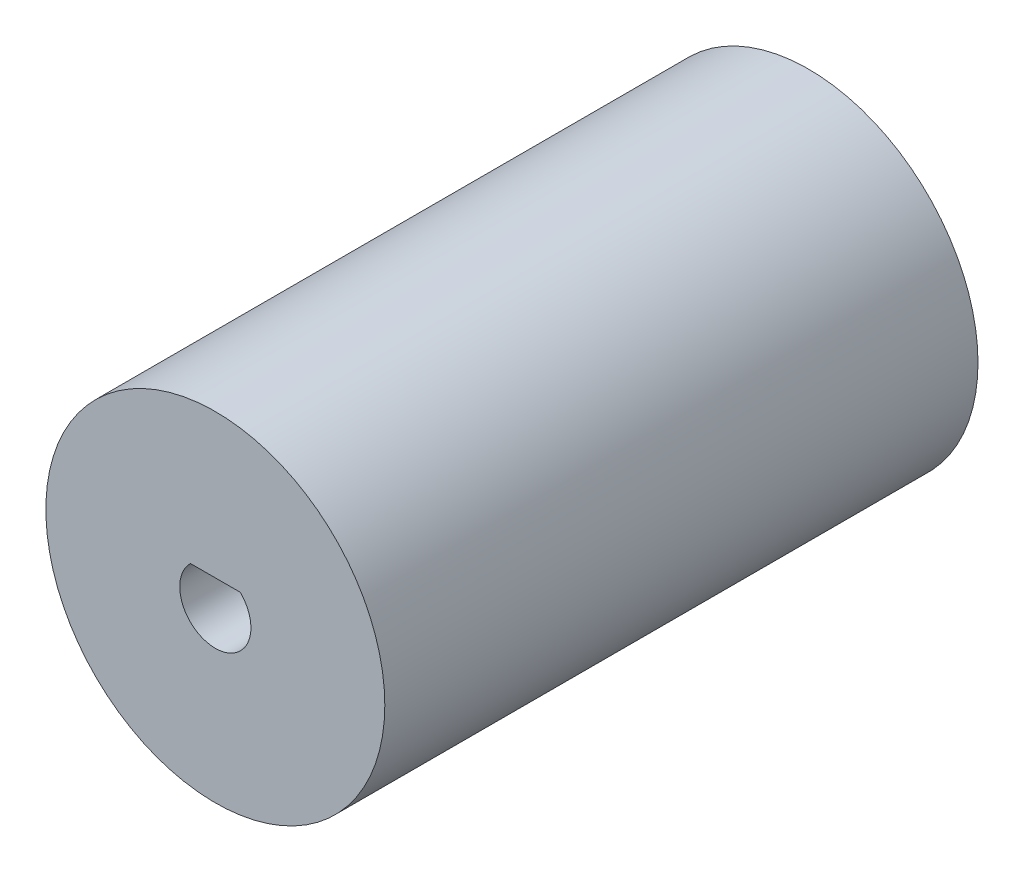
ISO-10303-21;
HEADER;
FILE_DESCRIPTION(('STEP AP214'),'2;1');
FILE_NAME('part.step','',(''),(''),'','','');
FILE_SCHEMA(('AUTOMOTIVE_DESIGN { 1 0 10303 214 1 1 1 1 }'));
ENDSEC;
DATA;
#1=APPLICATION_CONTEXT('core data for automotive mechanical design processes');
#2=APPLICATION_PROTOCOL_DEFINITION('international standard','automotive_design',2000,#1);
#3=PRODUCT_CONTEXT('',#1,'mechanical');
#4=PRODUCT('Part','Part','',(#3));
#5=PRODUCT_RELATED_PRODUCT_CATEGORY('part','',(#4));
#6=PRODUCT_DEFINITION_FORMATION('','',#4);
#7=PRODUCT_DEFINITION_CONTEXT('part definition',#1,'design');
#8=PRODUCT_DEFINITION('design','',#6,#7);
#9=PRODUCT_DEFINITION_SHAPE('','',#8);
#10=(LENGTH_UNIT() NAMED_UNIT(*) SI_UNIT(.MILLI.,.METRE.));
#11=(NAMED_UNIT(*) PLANE_ANGLE_UNIT() SI_UNIT($,.RADIAN.));
#12=(NAMED_UNIT(*) SI_UNIT($,.STERADIAN.) SOLID_ANGLE_UNIT());
#13=UNCERTAINTY_MEASURE_WITH_UNIT(LENGTH_MEASURE(1.E-05),#10,'distance_accuracy_value','');
#14=(GEOMETRIC_REPRESENTATION_CONTEXT(3) GLOBAL_UNCERTAINTY_ASSIGNED_CONTEXT((#13)) GLOBAL_UNIT_ASSIGNED_CONTEXT((#10,
#11,#12)) REPRESENTATION_CONTEXT('',''));
#15=CARTESIAN_POINT('',(0.,0.,0.));
#16=DIRECTION('',(0.,0.,1.));
#17=DIRECTION('',(1.,0.,0.));
#18=AXIS2_PLACEMENT_3D('',#15,#16,#17);
#19=CARTESIAN_POINT('',(0.,0.,35.));
#20=DIRECTION('',(0.,0.,-1.));
#21=DIRECTION('',(-1.,0.,0.));
#22=AXIS2_PLACEMENT_3D('',#19,#20,#21);
#23=CYLINDRICAL_SURFACE('',#22,10.);
#24=CARTESIAN_POINT('',(0.,0.,35.));
#25=DIRECTION('',(0.,0.,1.));
#26=DIRECTION('',(1.,0.,0.));
#27=AXIS2_PLACEMENT_3D('',#24,#25,#26);
#28=CIRCLE('',#27,10.);
#29=CARTESIAN_POINT('',(10.,0.,35.));
#30=VERTEX_POINT('',#29);
#31=EDGE_CURVE('E11',#30,#30,#28,.T.);
#32=ORIENTED_EDGE('',*,*,#31,.F.);
#33=EDGE_LOOP('',(#32));
#34=FACE_BOUND('',#33,.T.);
#35=CARTESIAN_POINT('',(0.,0.,0.));
#36=DIRECTION('',(0.,0.,1.));
#37=DIRECTION('',(1.,0.,0.));
#38=AXIS2_PLACEMENT_3D('',#35,#36,#37);
#39=CIRCLE('',#38,10.);
#40=CARTESIAN_POINT('',(10.,0.,0.));
#41=VERTEX_POINT('',#40);
#42=EDGE_CURVE('E50',#41,#41,#39,.T.);
#43=ORIENTED_EDGE('',*,*,#42,.T.);
#44=EDGE_LOOP('',(#43));
#45=FACE_BOUND('',#44,.T.);
#46=ADVANCED_FACE('F47',(#34,#45),#23,.T.);
#47=CARTESIAN_POINT('',(0.,0.,35.));
#48=DIRECTION('',(0.,0.,1.));
#49=DIRECTION('',(1.,0.,0.));
#50=AXIS2_PLACEMENT_3D('',#47,#48,#49);
#51=PLANE('',#50);
#52=CARTESIAN_POINT('',(0.,0.,35.));
#53=DIRECTION('',(0.,0.,1.));
#54=DIRECTION('',(1.,0.,0.));
#55=AXIS2_PLACEMENT_3D('',#52,#53,#54);
#56=CIRCLE('',#55,2.1);
#57=CARTESIAN_POINT('',(-1.46969384566991,1.5,35.));
#58=VERTEX_POINT('',#57);
#59=CARTESIAN_POINT('',(1.46969384566991,1.5,35.));
#60=VERTEX_POINT('',#59);
#61=EDGE_CURVE('E62',#58,#60,#56,.T.);
#62=ORIENTED_EDGE('',*,*,#61,.F.);
#63=DIRECTION('',(-1.,0.,0.));
#64=VECTOR('',#63,1.);
#65=CARTESIAN_POINT('',(-1.46969384566991,1.5,35.));
#66=LINE('',#65,#64);
#67=EDGE_CURVE('E83',#60,#58,#66,.T.);
#68=ORIENTED_EDGE('',*,*,#67,.F.);
#69=EDGE_LOOP('',(#62,#68));
#70=FACE_BOUND('',#69,.T.);
#71=ORIENTED_EDGE('',*,*,#31,.T.);
#72=EDGE_LOOP('',(#71));
#73=FACE_BOUND('',#72,.T.);
#74=ADVANCED_FACE('F88',(#70,#73),#51,.T.);
#75=CARTESIAN_POINT('',(0.,0.,0.));
#76=DIRECTION('',(0.,0.,1.));
#77=DIRECTION('',(1.,0.,0.));
#78=AXIS2_PLACEMENT_3D('',#75,#76,#77);
#79=PLANE('',#78);
#80=CARTESIAN_POINT('',(0.,0.,0.));
#81=DIRECTION('',(0.,0.,1.));
#82=DIRECTION('',(1.,0.,0.));
#83=AXIS2_PLACEMENT_3D('',#80,#81,#82);
#84=CIRCLE('',#83,6.05);
#85=CARTESIAN_POINT('',(6.05,0.,0.));
#86=VERTEX_POINT('',#85);
#87=EDGE_CURVE('E79',#86,#86,#84,.T.);
#88=ORIENTED_EDGE('',*,*,#87,.T.);
#89=EDGE_LOOP('',(#88));
#90=FACE_BOUND('',#89,.T.);
#91=ORIENTED_EDGE('',*,*,#42,.F.);
#92=EDGE_LOOP('',(#91));
#93=FACE_BOUND('',#92,.T.);
#94=ADVANCED_FACE('F106',(#90,#93),#79,.F.);
#95=CARTESIAN_POINT('',(0.,0.,25.));
#96=DIRECTION('',(0.,0.,-1.));
#97=DIRECTION('',(-1.,0.,0.));
#98=AXIS2_PLACEMENT_3D('',#95,#96,#97);
#99=CYLINDRICAL_SURFACE('',#98,6.05);
#100=CARTESIAN_POINT('',(0.,0.,25.));
#101=DIRECTION('',(0.,0.,1.));
#102=DIRECTION('',(1.,0.,0.));
#103=AXIS2_PLACEMENT_3D('',#100,#101,#102);
#104=CIRCLE('',#103,6.05);
#105=CARTESIAN_POINT('',(6.05,0.,25.));
#106=VERTEX_POINT('',#105);
#107=EDGE_CURVE('E98',#106,#106,#104,.T.);
#108=ORIENTED_EDGE('',*,*,#107,.T.);
#109=EDGE_LOOP('',(#108));
#110=FACE_BOUND('',#109,.T.);
#111=ORIENTED_EDGE('',*,*,#87,.F.);
#112=EDGE_LOOP('',(#111));
#113=FACE_BOUND('',#112,.T.);
#114=ADVANCED_FACE('F109',(#110,#113),#99,.F.);
#115=CARTESIAN_POINT('',(0.,0.,25.));
#116=DIRECTION('',(0.,0.,1.));
#117=DIRECTION('',(1.,0.,0.));
#118=AXIS2_PLACEMENT_3D('',#115,#116,#117);
#119=PLANE('',#118);
#120=ORIENTED_EDGE('',*,*,#107,.F.);
#121=EDGE_LOOP('',(#120));
#122=FACE_BOUND('',#121,.T.);
#123=ADVANCED_FACE('F111',(#122),#119,.F.);
#124=CARTESIAN_POINT('',(0.,0.,26.));
#125=DIRECTION('',(0.,0.,1.));
#126=DIRECTION('',(1.,0.,0.));
#127=AXIS2_PLACEMENT_3D('',#124,#125,#126);
#128=CYLINDRICAL_SURFACE('',#127,2.1);
#129=ORIENTED_EDGE('',*,*,#61,.T.);
#130=DIRECTION('',(0.,0.,1.));
#131=VECTOR('',#130,1.);
#132=CARTESIAN_POINT('',(1.46969384566991,1.5,26.));
#133=LINE('',#132,#131);
#134=CARTESIAN_POINT('',(1.46969384566991,1.5,26.));
#135=VERTEX_POINT('',#134);
#136=EDGE_CURVE('E80',#135,#60,#133,.T.);
#137=ORIENTED_EDGE('',*,*,#136,.F.);
#138=CARTESIAN_POINT('',(0.,0.,26.));
#139=DIRECTION('',(0.,0.,1.));
#140=DIRECTION('',(1.,0.,0.));
#141=AXIS2_PLACEMENT_3D('',#138,#139,#140);
#142=CIRCLE('',#141,2.1);
#143=CARTESIAN_POINT('',(-1.46969384566991,1.5,26.));
#144=VERTEX_POINT('',#143);
#145=EDGE_CURVE('E76',#144,#135,#142,.T.);
#146=ORIENTED_EDGE('',*,*,#145,.F.);
#147=DIRECTION('',(0.,0.,1.));
#148=VECTOR('',#147,1.);
#149=CARTESIAN_POINT('',(-1.46969384566991,1.5,26.));
#150=LINE('',#149,#148);
#151=EDGE_CURVE('E70',#144,#58,#150,.T.);
#152=ORIENTED_EDGE('',*,*,#151,.T.);
#153=EDGE_LOOP('',(#129,#137,#146,#152));
#154=FACE_BOUND('',#153,.T.);
#155=ADVANCED_FACE('F74',(#154),#128,.F.);
#156=CARTESIAN_POINT('',(-1.46969384566991,1.5,26.));
#157=DIRECTION('',(0.,1.,0.));
#158=DIRECTION('',(0.,0.,1.));
#159=AXIS2_PLACEMENT_3D('',#156,#157,#158);
#160=PLANE('',#159);
#161=ORIENTED_EDGE('',*,*,#67,.T.);
#162=ORIENTED_EDGE('',*,*,#151,.F.);
#163=DIRECTION('',(-1.,0.,0.));
#164=VECTOR('',#163,1.);
#165=CARTESIAN_POINT('',(-1.46969384566991,1.5,26.));
#166=LINE('',#165,#164);
#167=EDGE_CURVE('E93',#135,#144,#166,.T.);
#168=ORIENTED_EDGE('',*,*,#167,.F.);
#169=ORIENTED_EDGE('',*,*,#136,.T.);
#170=EDGE_LOOP('',(#161,#162,#168,#169));
#171=FACE_BOUND('',#170,.T.);
#172=ADVANCED_FACE('F84',(#171),#160,.F.);
#173=CARTESIAN_POINT('',(0.,0.,26.));
#174=DIRECTION('',(0.,0.,1.));
#175=DIRECTION('',(1.,0.,0.));
#176=AXIS2_PLACEMENT_3D('',#173,#174,#175);
#177=PLANE('',#176);
#178=ORIENTED_EDGE('',*,*,#145,.T.);
#179=ORIENTED_EDGE('',*,*,#167,.T.);
#180=EDGE_LOOP('',(#178,#179));
#181=FACE_BOUND('',#180,.T.);
#182=ADVANCED_FACE('F150',(#181),#177,.T.);
#183=CLOSED_SHELL('',(#46,#74,#94,#114,#123,#155,#172,#182));
#184=MANIFOLD_SOLID_BREP('B2',#183);
#185=ADVANCED_BREP_SHAPE_REPRESENTATION('',(#18,#184),#14);
#186=SHAPE_DEFINITION_REPRESENTATION(#9,#185);
ENDSEC;
END-ISO-10303-21;
